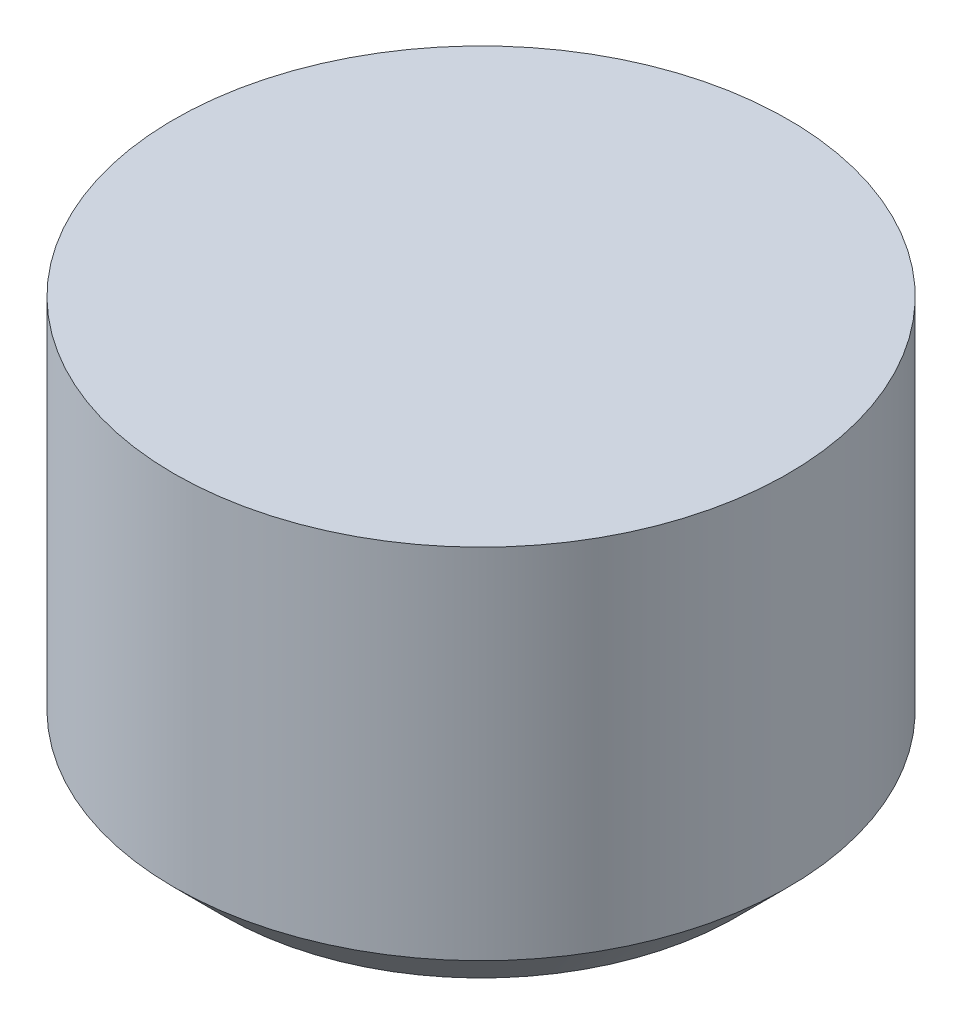
ISO-10303-21;
HEADER;
FILE_DESCRIPTION(('STEP AP214'),'2;1');
FILE_NAME('part.step','',(''),(''),'','','');
FILE_SCHEMA(('AUTOMOTIVE_DESIGN { 1 0 10303 214 1 1 1 1 }'));
ENDSEC;
DATA;
#1=APPLICATION_CONTEXT('core data for automotive mechanical design processes');
#2=APPLICATION_PROTOCOL_DEFINITION('international standard','automotive_design',2000,#1);
#3=PRODUCT_CONTEXT('',#1,'mechanical');
#4=PRODUCT('Part','Part','',(#3));
#5=PRODUCT_RELATED_PRODUCT_CATEGORY('part','',(#4));
#6=PRODUCT_DEFINITION_FORMATION('','',#4);
#7=PRODUCT_DEFINITION_CONTEXT('part definition',#1,'design');
#8=PRODUCT_DEFINITION('design','',#6,#7);
#9=PRODUCT_DEFINITION_SHAPE('','',#8);
#10=(LENGTH_UNIT() NAMED_UNIT(*) SI_UNIT(.MILLI.,.METRE.));
#11=(NAMED_UNIT(*) PLANE_ANGLE_UNIT() SI_UNIT($,.RADIAN.));
#12=(NAMED_UNIT(*) SI_UNIT($,.STERADIAN.) SOLID_ANGLE_UNIT());
#13=UNCERTAINTY_MEASURE_WITH_UNIT(LENGTH_MEASURE(1.E-05),#10,'distance_accuracy_value','');
#14=(GEOMETRIC_REPRESENTATION_CONTEXT(3) GLOBAL_UNCERTAINTY_ASSIGNED_CONTEXT((#13)) GLOBAL_UNIT_ASSIGNED_CONTEXT((#10,
#11,#12)) REPRESENTATION_CONTEXT('',''));
#15=CARTESIAN_POINT('',(0.,0.,0.));
#16=DIRECTION('',(0.,0.,1.));
#17=DIRECTION('',(1.,0.,0.));
#18=AXIS2_PLACEMENT_3D('',#15,#16,#17);
#19=CARTESIAN_POINT('',(0.,12.,0.));
#20=DIRECTION('',(0.,-1.,0.));
#21=DIRECTION('',(0.,0.,-1.));
#22=AXIS2_PLACEMENT_3D('',#19,#20,#21);
#23=CYLINDRICAL_SURFACE('',#22,9.);
#24=CARTESIAN_POINT('',(0.,1.5,0.));
#25=DIRECTION('',(0.,1.,0.));
#26=DIRECTION('',(0.,0.,1.));
#27=AXIS2_PLACEMENT_3D('',#24,#25,#26);
#28=CIRCLE('',#27,9.);
#29=CARTESIAN_POINT('',(0.,1.5,9.));
#30=VERTEX_POINT('',#29);
#31=EDGE_CURVE('E54',#30,#30,#28,.T.);
#32=ORIENTED_EDGE('',*,*,#31,.T.);
#33=EDGE_LOOP('',(#32));
#34=FACE_BOUND('',#33,.T.);
#35=CARTESIAN_POINT('',(0.,12.,0.));
#36=DIRECTION('',(0.,1.,0.));
#37=DIRECTION('',(0.,0.,1.));
#38=AXIS2_PLACEMENT_3D('',#35,#36,#37);
#39=CIRCLE('',#38,9.);
#40=CARTESIAN_POINT('',(0.,12.,9.));
#41=VERTEX_POINT('',#40);
#42=EDGE_CURVE('E59',#41,#41,#39,.T.);
#43=ORIENTED_EDGE('',*,*,#42,.F.);
#44=EDGE_LOOP('',(#43));
#45=FACE_BOUND('',#44,.T.);
#46=ADVANCED_FACE('F45',(#34,#45),#23,.T.);
#47=CARTESIAN_POINT('',(0.,12.,0.));
#48=DIRECTION('',(0.,1.,0.));
#49=DIRECTION('',(0.,0.,1.));
#50=AXIS2_PLACEMENT_3D('',#47,#48,#49);
#51=PLANE('',#50);
#52=ORIENTED_EDGE('',*,*,#42,.T.);
#53=EDGE_LOOP('',(#52));
#54=FACE_BOUND('',#53,.T.);
#55=ADVANCED_FACE('F67',(#54),#51,.T.);
#56=CARTESIAN_POINT('',(0.,0.,0.));
#57=DIRECTION('',(0.,1.,0.));
#58=DIRECTION('',(0.,0.,1.));
#59=AXIS2_PLACEMENT_3D('',#56,#57,#58);
#60=PLANE('',#59);
#61=CARTESIAN_POINT('',(0.,0.,0.));
#62=DIRECTION('',(0.,1.,0.));
#63=DIRECTION('',(0.,0.,1.));
#64=AXIS2_PLACEMENT_3D('',#61,#62,#63);
#65=CIRCLE('',#64,7.49999999999999);
#66=CARTESIAN_POINT('',(0.,0.,7.49999999999999));
#67=VERTEX_POINT('',#66);
#68=EDGE_CURVE('E10',#67,#67,#65,.F.);
#69=ORIENTED_EDGE('',*,*,#68,.T.);
#70=EDGE_LOOP('',(#69));
#71=FACE_BOUND('',#70,.T.);
#72=ADVANCED_FACE('F74',(#71),#60,.F.);
#73=CARTESIAN_POINT('',(0.,1.5,0.));
#74=DIRECTION('',(0.,1.,0.));
#75=DIRECTION('',(0.,0.,1.));
#76=AXIS2_PLACEMENT_3D('',#73,#74,#75);
#77=CONICAL_SURFACE('',#76,9.,0.78539816339745);
#78=ORIENTED_EDGE('',*,*,#68,.F.);
#79=EDGE_LOOP('',(#78));
#80=FACE_BOUND('',#79,.T.);
#81=ORIENTED_EDGE('',*,*,#31,.F.);
#82=EDGE_LOOP('',(#81));
#83=FACE_BOUND('',#82,.T.);
#84=ADVANCED_FACE('F48',(#80,#83),#77,.T.);
#85=CLOSED_SHELL('',(#46,#55,#72,#84));
#86=MANIFOLD_SOLID_BREP('B2',#85);
#87=ADVANCED_BREP_SHAPE_REPRESENTATION('',(#18,#86),#14);
#88=SHAPE_DEFINITION_REPRESENTATION(#9,#87);
ENDSEC;
END-ISO-10303-21;
